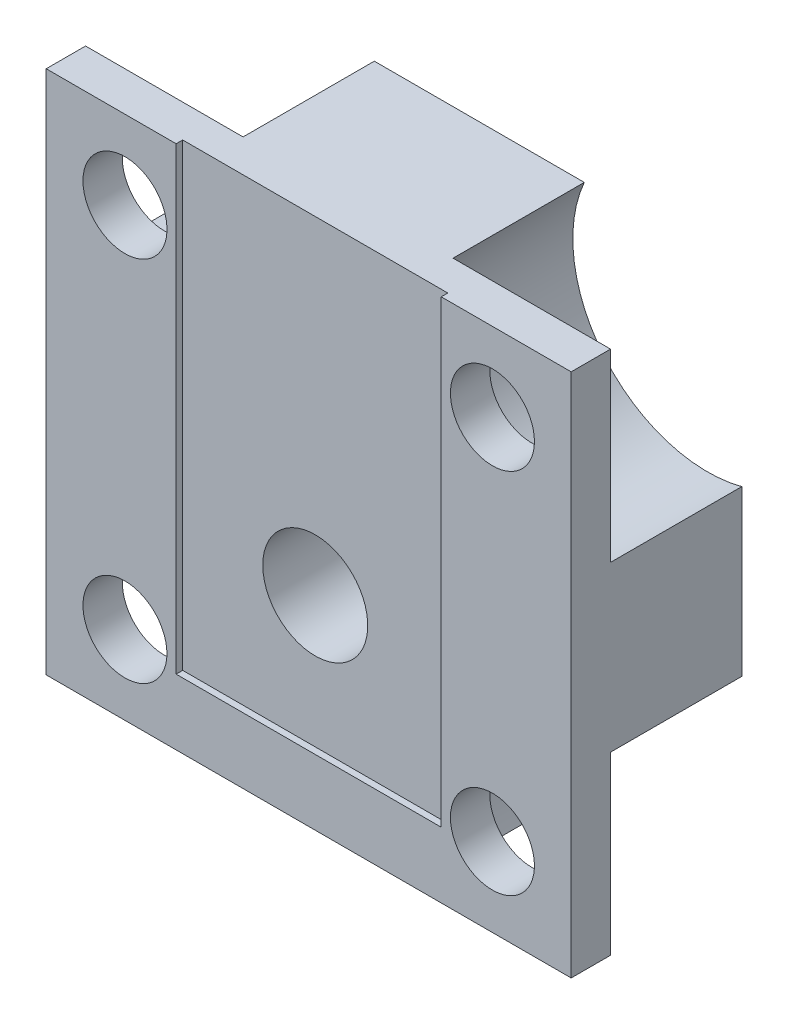
ISO-10303-21;
HEADER;
FILE_DESCRIPTION(('STEP AP214'),'2;1');
FILE_NAME('part.step','',(''),(''),'','','');
FILE_SCHEMA(('AUTOMOTIVE_DESIGN { 1 0 10303 214 1 1 1 1 }'));
ENDSEC;
DATA;
#1=APPLICATION_CONTEXT('core data for automotive mechanical design processes');
#2=APPLICATION_PROTOCOL_DEFINITION('international standard','automotive_design',2000,#1);
#3=PRODUCT_CONTEXT('',#1,'mechanical');
#4=PRODUCT('Part','Part','',(#3));
#5=PRODUCT_RELATED_PRODUCT_CATEGORY('part','',(#4));
#6=PRODUCT_DEFINITION_FORMATION('','',#4);
#7=PRODUCT_DEFINITION_CONTEXT('part definition',#1,'design');
#8=PRODUCT_DEFINITION('design','',#6,#7);
#9=PRODUCT_DEFINITION_SHAPE('','',#8);
#10=(LENGTH_UNIT() NAMED_UNIT(*) SI_UNIT(.MILLI.,.METRE.));
#11=(NAMED_UNIT(*) PLANE_ANGLE_UNIT() SI_UNIT($,.RADIAN.));
#12=(NAMED_UNIT(*) SI_UNIT($,.STERADIAN.) SOLID_ANGLE_UNIT());
#13=UNCERTAINTY_MEASURE_WITH_UNIT(LENGTH_MEASURE(1.E-05),#10,'distance_accuracy_value','');
#14=(GEOMETRIC_REPRESENTATION_CONTEXT(3) GLOBAL_UNCERTAINTY_ASSIGNED_CONTEXT((#13)) GLOBAL_UNIT_ASSIGNED_CONTEXT((#10,
#11,#12)) REPRESENTATION_CONTEXT('',''));
#15=CARTESIAN_POINT('',(0.,0.,0.));
#16=DIRECTION('',(0.,0.,1.));
#17=DIRECTION('',(1.,0.,0.));
#18=AXIS2_PLACEMENT_3D('',#15,#16,#17);
#19=CARTESIAN_POINT('',(0.,-2.5,-8.));
#20=DIRECTION('',(0.,0.,1.));
#21=DIRECTION('',(1.,0.,0.));
#22=AXIS2_PLACEMENT_3D('',#19,#20,#21);
#23=CYLINDRICAL_SURFACE('',#22,1.35);
#24=CARTESIAN_POINT('',(0.,-2.5,-7.));
#25=DIRECTION('',(0.,0.,-1.));
#26=DIRECTION('',(-1.,0.,0.));
#27=AXIS2_PLACEMENT_3D('',#24,#25,#26);
#28=CIRCLE('',#27,1.35);
#29=CARTESIAN_POINT('',(-1.35,-2.5,-7.));
#30=VERTEX_POINT('',#29);
#31=EDGE_CURVE('E11',#30,#30,#28,.F.);
#32=ORIENTED_EDGE('',*,*,#31,.T.);
#33=EDGE_LOOP('',(#32));
#34=FACE_BOUND('',#33,.T.);
#35=CARTESIAN_POINT('',(0.,-2.5,-6.5));
#36=DIRECTION('',(0.,0.,-1.));
#37=DIRECTION('',(-1.,0.,0.));
#38=AXIS2_PLACEMENT_3D('',#35,#36,#37);
#39=CIRCLE('',#38,1.35);
#40=CARTESIAN_POINT('',(-1.35,-2.5,-6.5));
#41=VERTEX_POINT('',#40);
#42=EDGE_CURVE('E57',#41,#41,#39,.T.);
#43=ORIENTED_EDGE('',*,*,#42,.T.);
#44=EDGE_LOOP('',(#43));
#45=FACE_BOUND('',#44,.T.);
#46=ADVANCED_FACE('F46',(#34,#45),#23,.T.);
#47=CARTESIAN_POINT('',(0.,-2.5,-8.));
#48=DIRECTION('',(0.,0.,-1.));
#49=DIRECTION('',(-1.,0.,0.));
#50=AXIS2_PLACEMENT_3D('',#47,#48,#49);
#51=PLANE('',#50);
#52=CARTESIAN_POINT('',(0.,-2.5,-8.));
#53=DIRECTION('',(0.,0.,-1.));
#54=DIRECTION('',(-1.,0.,0.));
#55=AXIS2_PLACEMENT_3D('',#52,#53,#54);
#56=CIRCLE('',#55,0.35);
#57=CARTESIAN_POINT('',(-0.35,-2.5,-8.));
#58=VERTEX_POINT('',#57);
#59=EDGE_CURVE('E53',#58,#58,#56,.T.);
#60=ORIENTED_EDGE('',*,*,#59,.T.);
#61=EDGE_LOOP('',(#60));
#62=FACE_BOUND('',#61,.T.);
#63=ADVANCED_FACE('F67',(#62),#51,.T.);
#64=CARTESIAN_POINT('',(0.,-2.5,-6.5));
#65=DIRECTION('',(0.,0.,-1.));
#66=DIRECTION('',(-1.,0.,0.));
#67=AXIS2_PLACEMENT_3D('',#64,#65,#66);
#68=PLANE('',#67);
#69=ORIENTED_EDGE('',*,*,#42,.F.);
#70=EDGE_LOOP('',(#69));
#71=FACE_BOUND('',#70,.T.);
#72=ADVANCED_FACE('F65',(#71),#68,.F.);
#73=CARTESIAN_POINT('',(0.,-2.5,-7.));
#74=DIRECTION('',(0.,0.,-1.));
#75=DIRECTION('',(-1.,0.,0.));
#76=AXIS2_PLACEMENT_3D('',#73,#74,#75);
#77=DEGENERATE_TOROIDAL_SURFACE('',#76,0.35,1.,.T.);
#78=ORIENTED_EDGE('',*,*,#31,.F.);
#79=EDGE_LOOP('',(#78));
#80=FACE_BOUND('',#79,.T.);
#81=ORIENTED_EDGE('',*,*,#59,.F.);
#82=EDGE_LOOP('',(#81));
#83=FACE_BOUND('',#82,.T.);
#84=ADVANCED_FACE('F48',(#80,#83),#77,.T.);
#85=CLOSED_SHELL('',(#46,#63,#72,#84));
#86=MANIFOLD_SOLID_BREP('B2',#85);
#87=CARTESIAN_POINT('',(10.,-10.,-1.5));
#88=DIRECTION('',(0.,0.,-1.));
#89=DIRECTION('',(-1.,0.,0.));
#90=AXIS2_PLACEMENT_3D('',#87,#88,#89);
#91=PLANE('',#90);
#92=CARTESIAN_POINT('',(7.,7.,-1.5));
#93=DIRECTION('',(0.,0.,1.));
#94=DIRECTION('',(1.,0.,0.));
#95=AXIS2_PLACEMENT_3D('',#92,#93,#94);
#96=CIRCLE('',#95,1.6);
#97=CARTESIAN_POINT('',(8.6,7.,-1.5));
#98=VERTEX_POINT('',#97);
#99=EDGE_CURVE('E318',#98,#98,#96,.T.);
#100=ORIENTED_EDGE('',*,*,#99,.T.);
#101=EDGE_LOOP('',(#100));
#102=FACE_BOUND('',#101,.T.);
#103=CARTESIAN_POINT('',(8.693225152791,7.925383175681,-1.5));
#104=DIRECTION('',(0.,0.,-1.));
#105=DIRECTION('',(-1.,0.,0.));
#106=AXIS2_PLACEMENT_3D('',#103,#104,#105);
#107=CIRCLE('',#106,5.131315357931);
#108=CARTESIAN_POINT('',(10.,2.96325290721379,-1.5));
#109=VERTEX_POINT('',#108);
#110=CARTESIAN_POINT('',(3.99999999999995,10.,-1.5));
#111=VERTEX_POINT('',#110);
#112=EDGE_CURVE('E113',#109,#111,#107,.T.);
#113=ORIENTED_EDGE('',*,*,#112,.T.);
#114=DIRECTION('',(-1.,0.,0.));
#115=VECTOR('',#114,1.);
#116=CARTESIAN_POINT('',(10.,10.,-1.5));
#117=LINE('',#116,#115);
#118=CARTESIAN_POINT('',(10.,10.,-1.5));
#119=VERTEX_POINT('',#118);
#120=EDGE_CURVE('E322',#111,#119,#117,.F.);
#121=ORIENTED_EDGE('',*,*,#120,.T.);
#122=DIRECTION('',(0.,1.,0.));
#123=VECTOR('',#122,1.);
#124=CARTESIAN_POINT('',(10.,-10.,-1.5));
#125=LINE('',#124,#123);
#126=EDGE_CURVE('E301',#119,#109,#125,.F.);
#127=ORIENTED_EDGE('',*,*,#126,.T.);
#128=EDGE_LOOP('',(#113,#121,#127));
#129=FACE_BOUND('',#128,.T.);
#130=ADVANCED_FACE('F109',(#102,#129),#91,.T.);
#131=CARTESIAN_POINT('',(7.,-7.,-1.5));
#132=DIRECTION('',(0.,0.,-1.));
#133=DIRECTION('',(-1.,0.,0.));
#134=AXIS2_PLACEMENT_3D('',#131,#132,#133);
#135=CIRCLE('',#134,1.6);
#136=CARTESIAN_POINT('',(5.4,-7.,-1.5));
#137=VERTEX_POINT('',#136);
#138=EDGE_CURVE('E315',#137,#137,#135,.F.);
#139=ORIENTED_EDGE('',*,*,#138,.T.);
#140=EDGE_LOOP('',(#139));
#141=FACE_BOUND('',#140,.T.);
#142=CARTESIAN_POINT('',(8.787094536655,-8.25,-1.5));
#143=DIRECTION('',(0.,0.,-1.));
#144=DIRECTION('',(-1.,0.,0.));
#145=AXIS2_PLACEMENT_3D('',#142,#143,#144);
#146=CIRCLE('',#145,5.096937718167);
#147=CARTESIAN_POINT('',(3.99999999999993,-10.,-1.5));
#148=VERTEX_POINT('',#147);
#149=CARTESIAN_POINT('',(10.,-3.29948139687757,-1.5));
#150=VERTEX_POINT('',#149);
#151=EDGE_CURVE('E163',#148,#150,#146,.T.);
#152=ORIENTED_EDGE('',*,*,#151,.T.);
#153=CARTESIAN_POINT('',(10.,-10.,-1.5));
#154=VERTEX_POINT('',#153);
#155=EDGE_CURVE('E296',#150,#154,#125,.F.);
#156=ORIENTED_EDGE('',*,*,#155,.T.);
#157=DIRECTION('',(-1.,0.,0.));
#158=VECTOR('',#157,1.);
#159=CARTESIAN_POINT('',(10.,-10.,-1.5));
#160=LINE('',#159,#158);
#161=EDGE_CURVE('E300',#154,#148,#160,.T.);
#162=ORIENTED_EDGE('',*,*,#161,.T.);
#163=EDGE_LOOP('',(#152,#156,#162));
#164=FACE_BOUND('',#163,.T.);
#165=ADVANCED_FACE('F298',(#141,#164),#91,.T.);
#166=CARTESIAN_POINT('',(-7.,-7.,-1.5));
#167=DIRECTION('',(0.,0.,1.));
#168=DIRECTION('',(1.,0.,0.));
#169=AXIS2_PLACEMENT_3D('',#166,#167,#168);
#170=CIRCLE('',#169,1.6);
#171=CARTESIAN_POINT('',(-5.4,-7.,-1.5));
#172=VERTEX_POINT('',#171);
#173=EDGE_CURVE('E377',#172,#172,#170,.T.);
#174=ORIENTED_EDGE('',*,*,#173,.T.);
#175=EDGE_LOOP('',(#174));
#176=FACE_BOUND('',#175,.T.);
#177=CARTESIAN_POINT('',(-8.787094536655,-8.25,-1.5));
#178=DIRECTION('',(0.,0.,-1.));
#179=DIRECTION('',(-1.,0.,0.));
#180=AXIS2_PLACEMENT_3D('',#177,#178,#179);
#181=CIRCLE('',#180,5.096937718167);
#182=CARTESIAN_POINT('',(-10.,-3.29948139687728,-1.5));
#183=VERTEX_POINT('',#182);
#184=CARTESIAN_POINT('',(-3.99999999999987,-10.,-1.5));
#185=VERTEX_POINT('',#184);
#186=EDGE_CURVE('E189',#183,#185,#181,.T.);
#187=ORIENTED_EDGE('',*,*,#186,.T.);
#188=CARTESIAN_POINT('',(-10.,-10.,-1.5));
#189=VERTEX_POINT('',#188);
#190=EDGE_CURVE('E225',#185,#189,#160,.T.);
#191=ORIENTED_EDGE('',*,*,#190,.T.);
#192=DIRECTION('',(0.,1.,0.));
#193=VECTOR('',#192,1.);
#194=CARTESIAN_POINT('',(-10.,-10.,-1.5));
#195=LINE('',#194,#193);
#196=EDGE_CURVE('E323',#189,#183,#195,.T.);
#197=ORIENTED_EDGE('',*,*,#196,.T.);
#198=EDGE_LOOP('',(#187,#191,#197));
#199=FACE_BOUND('',#198,.T.);
#200=ADVANCED_FACE('F440',(#176,#199),#91,.T.);
#201=CARTESIAN_POINT('',(-7.,7.,-1.5));
#202=DIRECTION('',(0.,0.,-1.));
#203=DIRECTION('',(-1.,0.,0.));
#204=AXIS2_PLACEMENT_3D('',#201,#202,#203);
#205=CIRCLE('',#204,1.6);
#206=CARTESIAN_POINT('',(-8.6,7.,-1.5));
#207=VERTEX_POINT('',#206);
#208=EDGE_CURVE('E374',#207,#207,#205,.F.);
#209=ORIENTED_EDGE('',*,*,#208,.T.);
#210=EDGE_LOOP('',(#209));
#211=FACE_BOUND('',#210,.T.);
#212=CARTESIAN_POINT('',(-8.693225152791,7.925383175681,-1.5));
#213=DIRECTION('',(0.,0.,-1.));
#214=DIRECTION('',(-1.,0.,0.));
#215=AXIS2_PLACEMENT_3D('',#212,#213,#214);
#216=CIRCLE('',#215,5.131315357931);
#217=CARTESIAN_POINT('',(-3.99999999999995,10.,-1.5));
#218=VERTEX_POINT('',#217);
#219=CARTESIAN_POINT('',(-10.,2.96325290721359,-1.5));
#220=VERTEX_POINT('',#219);
#221=EDGE_CURVE('E184',#218,#220,#216,.T.);
#222=ORIENTED_EDGE('',*,*,#221,.T.);
#223=CARTESIAN_POINT('',(-10.,10.,-1.5));
#224=VERTEX_POINT('',#223);
#225=EDGE_CURVE('E325',#220,#224,#195,.T.);
#226=ORIENTED_EDGE('',*,*,#225,.T.);
#227=EDGE_CURVE('E302',#224,#218,#117,.F.);
#228=ORIENTED_EDGE('',*,*,#227,.T.);
#229=EDGE_LOOP('',(#222,#226,#228));
#230=FACE_BOUND('',#229,.T.);
#231=ADVANCED_FACE('F442',(#211,#230),#91,.T.);
#232=CARTESIAN_POINT('',(0.,-7.5,-5.5));
#233=DIRECTION('',(0.,0.,1.));
#234=DIRECTION('',(1.,0.,0.));
#235=AXIS2_PLACEMENT_3D('',#232,#233,#234);
#236=PLANE('',#235);
#237=CARTESIAN_POINT('',(0.,-2.5,-5.5));
#238=DIRECTION('',(0.,0.,-1.));
#239=DIRECTION('',(-1.,0.,0.));
#240=AXIS2_PLACEMENT_3D('',#237,#238,#239);
#241=CIRCLE('',#240,1.35);
#242=CARTESIAN_POINT('',(-1.35,-2.5,-5.5));
#243=VERTEX_POINT('',#242);
#244=EDGE_CURVE('E373',#243,#243,#241,.T.);
#245=ORIENTED_EDGE('',*,*,#244,.T.);
#246=EDGE_LOOP('',(#245));
#247=FACE_BOUND('',#246,.T.);
#248=CARTESIAN_POINT('',(0.,-2.5,-5.5));
#249=DIRECTION('',(0.,0.,-1.));
#250=DIRECTION('',(-1.,0.,0.));
#251=AXIS2_PLACEMENT_3D('',#248,#249,#250);
#252=CIRCLE('',#251,2.);
#253=CARTESIAN_POINT('',(-2.,-2.5,-5.5));
#254=VERTEX_POINT('',#253);
#255=EDGE_CURVE('E399',#254,#254,#252,.F.);
#256=ORIENTED_EDGE('',*,*,#255,.T.);
#257=EDGE_LOOP('',(#256));
#258=FACE_BOUND('',#257,.T.);
#259=ADVANCED_FACE('F403',(#247,#258),#236,.T.);
#260=CARTESIAN_POINT('',(0.,-2.5,-1.5));
#261=DIRECTION('',(0.,0.,-1.));
#262=DIRECTION('',(-1.,0.,0.));
#263=AXIS2_PLACEMENT_3D('',#260,#261,#262);
#264=CYLINDRICAL_SURFACE('',#263,2.);
#265=ORIENTED_EDGE('',*,*,#255,.F.);
#266=EDGE_LOOP('',(#265));
#267=FACE_BOUND('',#266,.T.);
#268=CARTESIAN_POINT('',(0.,-2.5,-0.25));
#269=DIRECTION('',(0.,0.,-1.));
#270=DIRECTION('',(-1.,0.,0.));
#271=AXIS2_PLACEMENT_3D('',#268,#269,#270);
#272=CIRCLE('',#271,2.);
#273=CARTESIAN_POINT('',(-2.,-2.5,-0.25));
#274=VERTEX_POINT('',#273);
#275=EDGE_CURVE('E359',#274,#274,#272,.F.);
#276=ORIENTED_EDGE('',*,*,#275,.T.);
#277=EDGE_LOOP('',(#276));
#278=FACE_BOUND('',#277,.T.);
#279=ADVANCED_FACE('F405',(#267,#278),#264,.F.);
#280=CARTESIAN_POINT('',(0.,-2.5,-6.5));
#281=DIRECTION('',(0.,0.,-1.));
#282=DIRECTION('',(-1.,0.,0.));
#283=AXIS2_PLACEMENT_3D('',#280,#281,#282);
#284=CYLINDRICAL_SURFACE('',#283,1.35);
#285=CARTESIAN_POINT('',(0.,-2.5,-6.5));
#286=DIRECTION('',(0.,0.,-1.));
#287=DIRECTION('',(-1.,0.,0.));
#288=AXIS2_PLACEMENT_3D('',#285,#286,#287);
#289=CIRCLE('',#288,1.35);
#290=CARTESIAN_POINT('',(-1.35,-2.5,-6.5));
#291=VERTEX_POINT('',#290);
#292=EDGE_CURVE('E355',#291,#291,#289,.F.);
#293=ORIENTED_EDGE('',*,*,#292,.F.);
#294=EDGE_LOOP('',(#293));
#295=FACE_BOUND('',#294,.T.);
#296=ORIENTED_EDGE('',*,*,#244,.F.);
#297=EDGE_LOOP('',(#296));
#298=FACE_BOUND('',#297,.T.);
#299=ADVANCED_FACE('F408',(#295,#298),#284,.F.);
#300=CARTESIAN_POINT('',(5.05,10.,0.25));
#301=DIRECTION('',(1.,0.,0.));
#302=DIRECTION('',(0.,0.,-1.));
#303=AXIS2_PLACEMENT_3D('',#300,#301,#302);
#304=PLANE('',#303);
#305=DIRECTION('',(0.,1.,0.));
#306=VECTOR('',#305,1.);
#307=CARTESIAN_POINT('',(5.05,10.,-0.25));
#308=LINE('',#307,#306);
#309=CARTESIAN_POINT('',(5.05,10.,-0.25));
#310=VERTEX_POINT('',#309);
#311=CARTESIAN_POINT('',(5.05,-7.5,-0.25));
#312=VERTEX_POINT('',#311);
#313=EDGE_CURVE('E362',#310,#312,#308,.F.);
#314=ORIENTED_EDGE('',*,*,#313,.T.);
#315=DIRECTION('',(0.,0.,1.));
#316=VECTOR('',#315,1.);
#317=CARTESIAN_POINT('',(5.05,-7.5,0.));
#318=LINE('',#317,#316);
#319=CARTESIAN_POINT('',(5.05,-7.5,0.));
#320=VERTEX_POINT('',#319);
#321=EDGE_CURVE('E368',#320,#312,#318,.F.);
#322=ORIENTED_EDGE('',*,*,#321,.F.);
#323=DIRECTION('',(0.,1.,0.));
#324=VECTOR('',#323,1.);
#325=CARTESIAN_POINT('',(5.05,0.,0.));
#326=LINE('',#325,#324);
#327=CARTESIAN_POINT('',(5.05,10.,0.));
#328=VERTEX_POINT('',#327);
#329=EDGE_CURVE('E352',#328,#320,#326,.F.);
#330=ORIENTED_EDGE('',*,*,#329,.F.);
#331=DIRECTION('',(0.,0.,-1.));
#332=VECTOR('',#331,1.);
#333=CARTESIAN_POINT('',(5.05,10.,0.25));
#334=LINE('',#333,#332);
#335=EDGE_CURVE('E371',#310,#328,#334,.F.);
#336=ORIENTED_EDGE('',*,*,#335,.F.);
#337=EDGE_LOOP('',(#314,#322,#330,#336));
#338=FACE_BOUND('',#337,.T.);
#339=ADVANCED_FACE('F433',(#338),#304,.F.);
#340=CARTESIAN_POINT('',(0.,-7.5,0.));
#341=DIRECTION('',(0.,1.,0.));
#342=DIRECTION('',(0.,0.,1.));
#343=AXIS2_PLACEMENT_3D('',#340,#341,#342);
#344=PLANE('',#343);
#345=DIRECTION('',(0.,0.,1.));
#346=VECTOR('',#345,1.);
#347=CARTESIAN_POINT('',(-5.05,-7.5,-0.25));
#348=LINE('',#347,#346);
#349=CARTESIAN_POINT('',(-5.05,-7.5,-0.25));
#350=VERTEX_POINT('',#349);
#351=CARTESIAN_POINT('',(-5.05,-7.5,0.));
#352=VERTEX_POINT('',#351);
#353=EDGE_CURVE('E364',#350,#352,#348,.T.);
#354=ORIENTED_EDGE('',*,*,#353,.T.);
#355=DIRECTION('',(1.,0.,0.));
#356=VECTOR('',#355,1.);
#357=CARTESIAN_POINT('',(0.,-7.5,0.));
#358=LINE('',#357,#356);
#359=EDGE_CURVE('E349',#320,#352,#358,.F.);
#360=ORIENTED_EDGE('',*,*,#359,.F.);
#361=ORIENTED_EDGE('',*,*,#321,.T.);
#362=DIRECTION('',(-1.,0.,0.));
#363=VECTOR('',#362,1.);
#364=CARTESIAN_POINT('',(5.05,-7.5,-0.25));
#365=LINE('',#364,#363);
#366=EDGE_CURVE('E360',#312,#350,#365,.T.);
#367=ORIENTED_EDGE('',*,*,#366,.T.);
#368=EDGE_LOOP('',(#354,#360,#361,#367));
#369=FACE_BOUND('',#368,.T.);
#370=ADVANCED_FACE('F424',(#369),#344,.T.);
#371=CARTESIAN_POINT('',(-5.05,10.,-0.25));
#372=DIRECTION('',(-1.,0.,0.));
#373=DIRECTION('',(0.,0.,1.));
#374=AXIS2_PLACEMENT_3D('',#371,#372,#373);
#375=PLANE('',#374);
#376=DIRECTION('',(0.,1.,0.));
#377=VECTOR('',#376,1.);
#378=CARTESIAN_POINT('',(-5.05,10.,-0.25));
#379=LINE('',#378,#377);
#380=CARTESIAN_POINT('',(-5.05,10.,-0.25));
#381=VERTEX_POINT('',#380);
#382=EDGE_CURVE('E356',#350,#381,#379,.T.);
#383=ORIENTED_EDGE('',*,*,#382,.T.);
#384=DIRECTION('',(0.,0.,1.));
#385=VECTOR('',#384,1.);
#386=CARTESIAN_POINT('',(-5.05,10.,-0.25));
#387=LINE('',#386,#385);
#388=CARTESIAN_POINT('',(-5.05,10.,0.));
#389=VERTEX_POINT('',#388);
#390=EDGE_CURVE('E366',#389,#381,#387,.F.);
#391=ORIENTED_EDGE('',*,*,#390,.F.);
#392=DIRECTION('',(0.,1.,0.));
#393=VECTOR('',#392,1.);
#394=CARTESIAN_POINT('',(-5.05,0.,0.));
#395=LINE('',#394,#393);
#396=EDGE_CURVE('E346',#352,#389,#395,.T.);
#397=ORIENTED_EDGE('',*,*,#396,.F.);
#398=ORIENTED_EDGE('',*,*,#353,.F.);
#399=EDGE_LOOP('',(#383,#391,#397,#398));
#400=FACE_BOUND('',#399,.T.);
#401=ADVANCED_FACE('F416',(#400),#375,.F.);
#402=CARTESIAN_POINT('',(5.05,10.,-0.25));
#403=DIRECTION('',(0.,0.,-1.));
#404=DIRECTION('',(-1.,0.,0.));
#405=AXIS2_PLACEMENT_3D('',#402,#403,#404);
#406=PLANE('',#405);
#407=ORIENTED_EDGE('',*,*,#275,.F.);
#408=EDGE_LOOP('',(#407));
#409=FACE_BOUND('',#408,.T.);
#410=ORIENTED_EDGE('',*,*,#366,.F.);
#411=ORIENTED_EDGE('',*,*,#313,.F.);
#412=DIRECTION('',(1.,0.,0.));
#413=VECTOR('',#412,1.);
#414=CARTESIAN_POINT('',(0.,10.,-0.25));
#415=LINE('',#414,#413);
#416=EDGE_CURVE('E341',#381,#310,#415,.T.);
#417=ORIENTED_EDGE('',*,*,#416,.F.);
#418=ORIENTED_EDGE('',*,*,#382,.F.);
#419=EDGE_LOOP('',(#410,#411,#417,#418));
#420=FACE_BOUND('',#419,.T.);
#421=ADVANCED_FACE('F412',(#409,#420),#406,.F.);
#422=CARTESIAN_POINT('',(0.,0.,0.));
#423=DIRECTION('',(0.,0.,1.));
#424=DIRECTION('',(1.,0.,0.));
#425=AXIS2_PLACEMENT_3D('',#422,#423,#424);
#426=PLANE('',#425);
#427=CARTESIAN_POINT('',(-7.,7.,0.));
#428=DIRECTION('',(0.,0.,-1.));
#429=DIRECTION('',(-1.,0.,0.));
#430=AXIS2_PLACEMENT_3D('',#427,#428,#429);
#431=CIRCLE('',#430,1.6);
#432=CARTESIAN_POINT('',(-8.6,7.,0.));
#433=VERTEX_POINT('',#432);
#434=EDGE_CURVE('E382',#433,#433,#431,.T.);
#435=ORIENTED_EDGE('',*,*,#434,.T.);
#436=EDGE_LOOP('',(#435));
#437=FACE_BOUND('',#436,.T.);
#438=CARTESIAN_POINT('',(-7.,-7.,0.));
#439=DIRECTION('',(0.,0.,1.));
#440=DIRECTION('',(1.,0.,0.));
#441=AXIS2_PLACEMENT_3D('',#438,#439,#440);
#442=CIRCLE('',#441,1.6);
#443=CARTESIAN_POINT('',(-5.4,-7.,0.));
#444=VERTEX_POINT('',#443);
#445=EDGE_CURVE('E385',#444,#444,#442,.F.);
#446=ORIENTED_EDGE('',*,*,#445,.T.);
#447=EDGE_LOOP('',(#446));
#448=FACE_BOUND('',#447,.T.);
#449=CARTESIAN_POINT('',(7.,7.,0.));
#450=DIRECTION('',(0.,0.,1.));
#451=DIRECTION('',(1.,0.,0.));
#452=AXIS2_PLACEMENT_3D('',#449,#450,#451);
#453=CIRCLE('',#452,1.6);
#454=CARTESIAN_POINT('',(8.6,7.,0.));
#455=VERTEX_POINT('',#454);
#456=EDGE_CURVE('E388',#455,#455,#453,.F.);
#457=ORIENTED_EDGE('',*,*,#456,.T.);
#458=EDGE_LOOP('',(#457));
#459=FACE_BOUND('',#458,.T.);
#460=CARTESIAN_POINT('',(7.,-7.,0.));
#461=DIRECTION('',(0.,0.,-1.));
#462=DIRECTION('',(-1.,0.,0.));
#463=AXIS2_PLACEMENT_3D('',#460,#461,#462);
#464=CIRCLE('',#463,1.6);
#465=CARTESIAN_POINT('',(5.4,-7.,0.));
#466=VERTEX_POINT('',#465);
#467=EDGE_CURVE('E327',#466,#466,#464,.T.);
#468=ORIENTED_EDGE('',*,*,#467,.T.);
#469=EDGE_LOOP('',(#468));
#470=FACE_BOUND('',#469,.T.);
#471=DIRECTION('',(0.,1.,0.));
#472=VECTOR('',#471,1.);
#473=CARTESIAN_POINT('',(-10.,-10.,0.));
#474=LINE('',#473,#472);
#475=CARTESIAN_POINT('',(-10.,-10.,0.));
#476=VERTEX_POINT('',#475);
#477=CARTESIAN_POINT('',(-10.,10.,0.));
#478=VERTEX_POINT('',#477);
#479=EDGE_CURVE('E344',#476,#478,#474,.T.);
#480=ORIENTED_EDGE('',*,*,#479,.F.);
#481=DIRECTION('',(1.,0.,0.));
#482=VECTOR('',#481,1.);
#483=CARTESIAN_POINT('',(0.,-10.,0.));
#484=LINE('',#483,#482);
#485=CARTESIAN_POINT('',(10.,-10.,0.));
#486=VERTEX_POINT('',#485);
#487=EDGE_CURVE('E312',#476,#486,#484,.T.);
#488=ORIENTED_EDGE('',*,*,#487,.T.);
#489=DIRECTION('',(0.,1.,0.));
#490=VECTOR('',#489,1.);
#491=CARTESIAN_POINT('',(10.,-10.,0.));
#492=LINE('',#491,#490);
#493=CARTESIAN_POINT('',(10.,10.,0.));
#494=VERTEX_POINT('',#493);
#495=EDGE_CURVE('E309',#494,#486,#492,.F.);
#496=ORIENTED_EDGE('',*,*,#495,.F.);
#497=DIRECTION('',(1.,0.,0.));
#498=VECTOR('',#497,1.);
#499=CARTESIAN_POINT('',(0.,10.,0.));
#500=LINE('',#499,#498);
#501=EDGE_CURVE('E339',#328,#494,#500,.T.);
#502=ORIENTED_EDGE('',*,*,#501,.F.);
#503=ORIENTED_EDGE('',*,*,#329,.T.);
#504=ORIENTED_EDGE('',*,*,#359,.T.);
#505=ORIENTED_EDGE('',*,*,#396,.T.);
#506=DIRECTION('',(1.,0.,0.));
#507=VECTOR('',#506,1.);
#508=CARTESIAN_POINT('',(0.,10.,0.));
#509=LINE('',#508,#507);
#510=EDGE_CURVE('E333',#478,#389,#509,.T.);
#511=ORIENTED_EDGE('',*,*,#510,.F.);
#512=EDGE_LOOP('',(#480,#488,#496,#502,#503,#504,#505,#511));
#513=FACE_BOUND('',#512,.T.);
#514=ADVANCED_FACE('F415',(#437,#448,#459,#470,#513),#426,.T.);
#515=CARTESIAN_POINT('',(7.,-7.,1.5));
#516=DIRECTION('',(0.,0.,-1.));
#517=DIRECTION('',(-1.,0.,0.));
#518=AXIS2_PLACEMENT_3D('',#515,#516,#517);
#519=CYLINDRICAL_SURFACE('',#518,1.6);
#520=ORIENTED_EDGE('',*,*,#138,.F.);
#521=EDGE_LOOP('',(#520));
#522=FACE_BOUND('',#521,.T.);
#523=ORIENTED_EDGE('',*,*,#467,.F.);
#524=EDGE_LOOP('',(#523));
#525=FACE_BOUND('',#524,.T.);
#526=ADVANCED_FACE('F465',(#522,#525),#519,.F.);
#527=CARTESIAN_POINT('',(7.,7.,1.5));
#528=DIRECTION('',(0.,0.,1.));
#529=DIRECTION('',(1.,0.,0.));
#530=AXIS2_PLACEMENT_3D('',#527,#528,#529);
#531=CYLINDRICAL_SURFACE('',#530,1.6);
#532=ORIENTED_EDGE('',*,*,#99,.F.);
#533=EDGE_LOOP('',(#532));
#534=FACE_BOUND('',#533,.T.);
#535=ORIENTED_EDGE('',*,*,#456,.F.);
#536=EDGE_LOOP('',(#535));
#537=FACE_BOUND('',#536,.T.);
#538=ADVANCED_FACE('F461',(#534,#537),#531,.F.);
#539=CARTESIAN_POINT('',(-7.,-7.,1.5));
#540=DIRECTION('',(0.,0.,1.));
#541=DIRECTION('',(1.,0.,0.));
#542=AXIS2_PLACEMENT_3D('',#539,#540,#541);
#543=CYLINDRICAL_SURFACE('',#542,1.6);
#544=ORIENTED_EDGE('',*,*,#173,.F.);
#545=EDGE_LOOP('',(#544));
#546=FACE_BOUND('',#545,.T.);
#547=ORIENTED_EDGE('',*,*,#445,.F.);
#548=EDGE_LOOP('',(#547));
#549=FACE_BOUND('',#548,.T.);
#550=ADVANCED_FACE('F464',(#546,#549),#543,.F.);
#551=CARTESIAN_POINT('',(-7.,7.,1.5));
#552=DIRECTION('',(0.,0.,-1.));
#553=DIRECTION('',(-1.,0.,0.));
#554=AXIS2_PLACEMENT_3D('',#551,#552,#553);
#555=CYLINDRICAL_SURFACE('',#554,1.6);
#556=ORIENTED_EDGE('',*,*,#208,.F.);
#557=EDGE_LOOP('',(#556));
#558=FACE_BOUND('',#557,.T.);
#559=ORIENTED_EDGE('',*,*,#434,.F.);
#560=EDGE_LOOP('',(#559));
#561=FACE_BOUND('',#560,.T.);
#562=ADVANCED_FACE('F450',(#558,#561),#555,.F.);
#563=CARTESIAN_POINT('',(8.693225152791,7.925383175681,-1.5));
#564=DIRECTION('',(0.,0.,-1.));
#565=DIRECTION('',(-1.,0.,0.));
#566=AXIS2_PLACEMENT_3D('',#563,#564,#565);
#567=CYLINDRICAL_SURFACE('',#566,5.131315357931);
#568=CARTESIAN_POINT('',(8.693225152791,7.925383175681,-6.5));
#569=DIRECTION('',(0.,0.,-1.));
#570=DIRECTION('',(-1.,0.,0.));
#571=AXIS2_PLACEMENT_3D('',#568,#569,#570);
#572=CIRCLE('',#571,5.131315357931);
#573=CARTESIAN_POINT('',(3.99999999999995,10.,-6.5));
#574=VERTEX_POINT('',#573);
#575=CARTESIAN_POINT('',(10.,2.9632529072138,-6.5));
#576=VERTEX_POINT('',#575);
#577=EDGE_CURVE('E157',#574,#576,#572,.F.);
#578=ORIENTED_EDGE('',*,*,#577,.F.);
#579=DIRECTION('',(0.,0.,1.));
#580=VECTOR('',#579,1.);
#581=CARTESIAN_POINT('',(4.,10.,-1.5));
#582=LINE('',#581,#580);
#583=EDGE_CURVE('E179',#111,#574,#582,.F.);
#584=ORIENTED_EDGE('',*,*,#583,.F.);
#585=ORIENTED_EDGE('',*,*,#112,.F.);
#586=DIRECTION('',(0.,0.,-1.));
#587=VECTOR('',#586,1.);
#588=CARTESIAN_POINT('',(10.,2.963252907214,-1.5));
#589=LINE('',#588,#587);
#590=EDGE_CURVE('E153',#576,#109,#589,.F.);
#591=ORIENTED_EDGE('',*,*,#590,.F.);
#592=EDGE_LOOP('',(#578,#584,#585,#591));
#593=FACE_BOUND('',#592,.T.);
#594=ADVANCED_FACE('F111',(#593),#567,.F.);
#595=CARTESIAN_POINT('',(10.,2.963252907214,-1.5));
#596=DIRECTION('',(1.,0.,0.));
#597=DIRECTION('',(0.,0.,-1.));
#598=AXIS2_PLACEMENT_3D('',#595,#596,#597);
#599=PLANE('',#598);
#600=ORIENTED_EDGE('',*,*,#590,.T.);
#601=ORIENTED_EDGE('',*,*,#126,.F.);
#602=DIRECTION('',(0.,0.,-1.));
#603=VECTOR('',#602,1.);
#604=CARTESIAN_POINT('',(10.,10.,1.5));
#605=LINE('',#604,#603);
#606=EDGE_CURVE('E331',#119,#494,#605,.F.);
#607=ORIENTED_EDGE('',*,*,#606,.T.);
#608=ORIENTED_EDGE('',*,*,#495,.T.);
#609=DIRECTION('',(0.,0.,1.));
#610=VECTOR('',#609,1.);
#611=CARTESIAN_POINT('',(10.,-10.,0.));
#612=LINE('',#611,#610);
#613=EDGE_CURVE('E306',#486,#154,#612,.F.);
#614=ORIENTED_EDGE('',*,*,#613,.T.);
#615=ORIENTED_EDGE('',*,*,#155,.F.);
#616=DIRECTION('',(0.,0.,-1.));
#617=VECTOR('',#616,1.);
#618=CARTESIAN_POINT('',(9.99999999999987,-3.29948139687754,-1.5));
#619=LINE('',#618,#617);
#620=CARTESIAN_POINT('',(9.99999999999993,-3.29948139687755,-6.5));
#621=VERTEX_POINT('',#620);
#622=EDGE_CURVE('E170',#150,#621,#619,.T.);
#623=ORIENTED_EDGE('',*,*,#622,.T.);
#624=DIRECTION('',(0.,1.,0.));
#625=VECTOR('',#624,1.);
#626=CARTESIAN_POINT('',(10.,-10.,-6.5));
#627=LINE('',#626,#625);
#628=EDGE_CURVE('E166',#576,#621,#627,.F.);
#629=ORIENTED_EDGE('',*,*,#628,.F.);
#630=EDGE_LOOP('',(#600,#601,#607,#608,#614,#615,#623,#629));
#631=FACE_BOUND('',#630,.T.);
#632=ADVANCED_FACE('F167',(#631),#599,.T.);
#633=CARTESIAN_POINT('',(8.787094536655,-8.25,-1.5));
#634=DIRECTION('',(0.,0.,-1.));
#635=DIRECTION('',(-1.,0.,0.));
#636=AXIS2_PLACEMENT_3D('',#633,#634,#635);
#637=CYLINDRICAL_SURFACE('',#636,5.096937718167);
#638=ORIENTED_EDGE('',*,*,#622,.F.);
#639=ORIENTED_EDGE('',*,*,#151,.F.);
#640=DIRECTION('',(0.,0.,-1.));
#641=VECTOR('',#640,1.);
#642=CARTESIAN_POINT('',(4.,-10.,-1.5));
#643=LINE('',#642,#641);
#644=CARTESIAN_POINT('',(3.99999999999993,-10.,-6.5));
#645=VERTEX_POINT('',#644);
#646=EDGE_CURVE('E192',#645,#148,#643,.F.);
#647=ORIENTED_EDGE('',*,*,#646,.F.);
#648=CARTESIAN_POINT('',(8.787094536655,-8.25,-6.5));
#649=DIRECTION('',(0.,0.,-1.));
#650=DIRECTION('',(-1.,0.,0.));
#651=AXIS2_PLACEMENT_3D('',#648,#649,#650);
#652=CIRCLE('',#651,5.096937718167);
#653=EDGE_CURVE('E173',#621,#645,#652,.F.);
#654=ORIENTED_EDGE('',*,*,#653,.F.);
#655=EDGE_LOOP('',(#638,#639,#647,#654));
#656=FACE_BOUND('',#655,.T.);
#657=ADVANCED_FACE('F507',(#656),#637,.F.);
#658=CARTESIAN_POINT('',(4.,-10.,-1.5));
#659=DIRECTION('',(0.,-1.,0.));
#660=DIRECTION('',(0.,0.,-1.));
#661=AXIS2_PLACEMENT_3D('',#658,#659,#660);
#662=PLANE('',#661);
#663=ORIENTED_EDGE('',*,*,#646,.T.);
#664=ORIENTED_EDGE('',*,*,#161,.F.);
#665=ORIENTED_EDGE('',*,*,#613,.F.);
#666=ORIENTED_EDGE('',*,*,#487,.F.);
#667=DIRECTION('',(0.,0.,1.));
#668=VECTOR('',#667,1.);
#669=CARTESIAN_POINT('',(-10.,-10.,0.));
#670=LINE('',#669,#668);
#671=EDGE_CURVE('E311',#189,#476,#670,.T.);
#672=ORIENTED_EDGE('',*,*,#671,.F.);
#673=ORIENTED_EDGE('',*,*,#190,.F.);
#674=DIRECTION('',(0.,0.,-1.));
#675=VECTOR('',#674,1.);
#676=CARTESIAN_POINT('',(-3.99999999999988,-10.,-1.5));
#677=LINE('',#676,#675);
#678=CARTESIAN_POINT('',(-3.99999999999987,-10.,-6.5));
#679=VERTEX_POINT('',#678);
#680=EDGE_CURVE('E191',#185,#679,#677,.T.);
#681=ORIENTED_EDGE('',*,*,#680,.T.);
#682=DIRECTION('',(-1.,0.,0.));
#683=VECTOR('',#682,1.);
#684=CARTESIAN_POINT('',(0.,-10.,-6.5));
#685=LINE('',#684,#683);
#686=EDGE_CURVE('E206',#645,#679,#685,.T.);
#687=ORIENTED_EDGE('',*,*,#686,.F.);
#688=EDGE_LOOP('',(#663,#664,#665,#666,#672,#673,#681,#687));
#689=FACE_BOUND('',#688,.T.);
#690=ADVANCED_FACE('F221',(#689),#662,.T.);
#691=CARTESIAN_POINT('',(-8.787094536655,-8.25,-1.5));
#692=DIRECTION('',(0.,0.,-1.));
#693=DIRECTION('',(-1.,0.,0.));
#694=AXIS2_PLACEMENT_3D('',#691,#692,#693);
#695=CYLINDRICAL_SURFACE('',#694,5.096937718167);
#696=ORIENTED_EDGE('',*,*,#680,.F.);
#697=ORIENTED_EDGE('',*,*,#186,.F.);
#698=DIRECTION('',(0.,0.,1.));
#699=VECTOR('',#698,1.);
#700=CARTESIAN_POINT('',(-10.,-3.299481396877,-1.5));
#701=LINE('',#700,#699);
#702=CARTESIAN_POINT('',(-10.,-3.29948139687728,-6.5));
#703=VERTEX_POINT('',#702);
#704=EDGE_CURVE('E188',#703,#183,#701,.T.);
#705=ORIENTED_EDGE('',*,*,#704,.F.);
#706=CARTESIAN_POINT('',(-8.787094536655,-8.25,-6.5));
#707=DIRECTION('',(0.,0.,-1.));
#708=DIRECTION('',(-1.,0.,0.));
#709=AXIS2_PLACEMENT_3D('',#706,#707,#708);
#710=CIRCLE('',#709,5.096937718167);
#711=EDGE_CURVE('E205',#679,#703,#710,.F.);
#712=ORIENTED_EDGE('',*,*,#711,.F.);
#713=EDGE_LOOP('',(#696,#697,#705,#712));
#714=FACE_BOUND('',#713,.T.);
#715=ADVANCED_FACE('F228',(#714),#695,.F.);
#716=CARTESIAN_POINT('',(-10.,-3.299481396877,-1.5));
#717=DIRECTION('',(-1.,0.,0.));
#718=DIRECTION('',(0.,0.,1.));
#719=AXIS2_PLACEMENT_3D('',#716,#717,#718);
#720=PLANE('',#719);
#721=ORIENTED_EDGE('',*,*,#704,.T.);
#722=ORIENTED_EDGE('',*,*,#196,.F.);
#723=ORIENTED_EDGE('',*,*,#671,.T.);
#724=ORIENTED_EDGE('',*,*,#479,.T.);
#725=DIRECTION('',(0.,0.,1.));
#726=VECTOR('',#725,1.);
#727=CARTESIAN_POINT('',(-10.,10.,0.));
#728=LINE('',#727,#726);
#729=EDGE_CURVE('E336',#224,#478,#728,.T.);
#730=ORIENTED_EDGE('',*,*,#729,.F.);
#731=ORIENTED_EDGE('',*,*,#225,.F.);
#732=DIRECTION('',(0.,0.,-1.));
#733=VECTOR('',#732,1.);
#734=CARTESIAN_POINT('',(-10.0000000000001,2.96325290721362,-1.5));
#735=LINE('',#734,#733);
#736=CARTESIAN_POINT('',(-10.,2.9632529072136,-6.5));
#737=VERTEX_POINT('',#736);
#738=EDGE_CURVE('E187',#220,#737,#735,.T.);
#739=ORIENTED_EDGE('',*,*,#738,.T.);
#740=DIRECTION('',(0.,1.,0.));
#741=VECTOR('',#740,1.);
#742=CARTESIAN_POINT('',(-10.,-10.,-6.5));
#743=LINE('',#742,#741);
#744=EDGE_CURVE('E204',#703,#737,#743,.T.);
#745=ORIENTED_EDGE('',*,*,#744,.F.);
#746=EDGE_LOOP('',(#721,#722,#723,#724,#730,#731,#739,#745));
#747=FACE_BOUND('',#746,.T.);
#748=ADVANCED_FACE('F233',(#747),#720,.T.);
#749=CARTESIAN_POINT('',(-8.693225152791,7.925383175681,-1.5));
#750=DIRECTION('',(0.,0.,-1.));
#751=DIRECTION('',(-1.,0.,0.));
#752=AXIS2_PLACEMENT_3D('',#749,#750,#751);
#753=CYLINDRICAL_SURFACE('',#752,5.131315357931);
#754=CARTESIAN_POINT('',(-8.693225152791,7.925383175681,-6.5));
#755=DIRECTION('',(0.,0.,-1.));
#756=DIRECTION('',(-1.,0.,0.));
#757=AXIS2_PLACEMENT_3D('',#754,#755,#756);
#758=CIRCLE('',#757,5.131315357931);
#759=CARTESIAN_POINT('',(-3.99999999999995,10.,-6.5));
#760=VERTEX_POINT('',#759);
#761=EDGE_CURVE('E119',#737,#760,#758,.F.);
#762=ORIENTED_EDGE('',*,*,#761,.F.);
#763=ORIENTED_EDGE('',*,*,#738,.F.);
#764=ORIENTED_EDGE('',*,*,#221,.F.);
#765=DIRECTION('',(0.,0.,1.));
#766=VECTOR('',#765,1.);
#767=CARTESIAN_POINT('',(-4.,10.,-1.5));
#768=LINE('',#767,#766);
#769=EDGE_CURVE('E128',#760,#218,#768,.T.);
#770=ORIENTED_EDGE('',*,*,#769,.F.);
#771=EDGE_LOOP('',(#762,#763,#764,#770));
#772=FACE_BOUND('',#771,.T.);
#773=ADVANCED_FACE('F236',(#772),#753,.F.);
#774=CARTESIAN_POINT('',(-4.,10.,-1.5));
#775=DIRECTION('',(0.,1.,0.));
#776=DIRECTION('',(0.,0.,1.));
#777=AXIS2_PLACEMENT_3D('',#774,#775,#776);
#778=PLANE('',#777);
#779=ORIENTED_EDGE('',*,*,#769,.T.);
#780=ORIENTED_EDGE('',*,*,#227,.F.);
#781=ORIENTED_EDGE('',*,*,#729,.T.);
#782=ORIENTED_EDGE('',*,*,#510,.T.);
#783=ORIENTED_EDGE('',*,*,#390,.T.);
#784=ORIENTED_EDGE('',*,*,#416,.T.);
#785=ORIENTED_EDGE('',*,*,#335,.T.);
#786=ORIENTED_EDGE('',*,*,#501,.T.);
#787=ORIENTED_EDGE('',*,*,#606,.F.);
#788=ORIENTED_EDGE('',*,*,#120,.F.);
#789=ORIENTED_EDGE('',*,*,#583,.T.);
#790=DIRECTION('',(-1.,0.,0.));
#791=VECTOR('',#790,1.);
#792=CARTESIAN_POINT('',(0.,10.,-6.5));
#793=LINE('',#792,#791);
#794=EDGE_CURVE('E44',#760,#574,#793,.F.);
#795=ORIENTED_EDGE('',*,*,#794,.F.);
#796=EDGE_LOOP('',(#779,#780,#781,#782,#783,#784,#785,#786,#787,#788,#789,#795));
#797=FACE_BOUND('',#796,.T.);
#798=ADVANCED_FACE('F435',(#797),#778,.T.);
#799=CARTESIAN_POINT('',(0.,-10.,-6.5));
#800=DIRECTION('',(0.,0.,-1.));
#801=DIRECTION('',(-1.,0.,0.));
#802=AXIS2_PLACEMENT_3D('',#799,#800,#801);
#803=PLANE('',#802);
#804=ORIENTED_EDGE('',*,*,#711,.T.);
#805=ORIENTED_EDGE('',*,*,#744,.T.);
#806=ORIENTED_EDGE('',*,*,#761,.T.);
#807=ORIENTED_EDGE('',*,*,#794,.T.);
#808=ORIENTED_EDGE('',*,*,#577,.T.);
#809=ORIENTED_EDGE('',*,*,#628,.T.);
#810=ORIENTED_EDGE('',*,*,#653,.T.);
#811=ORIENTED_EDGE('',*,*,#686,.T.);
#812=EDGE_LOOP('',(#804,#805,#806,#807,#808,#809,#810,#811));
#813=FACE_BOUND('',#812,.T.);
#814=ORIENTED_EDGE('',*,*,#292,.T.);
#815=EDGE_LOOP('',(#814));
#816=FACE_BOUND('',#815,.T.);
#817=ADVANCED_FACE('F175',(#813,#816),#803,.T.);
#818=CLOSED_SHELL('',(#130,#165,#200,#231,#259,#279,#299,#339,#370,#401,#421,#514,#526,#538,
#550,#562,#594,#632,#657,#690,#715,#748,#773,#798,#817));
#819=MANIFOLD_SOLID_BREP('B6',#818);
#820=ADVANCED_BREP_SHAPE_REPRESENTATION('',(#18,#86,#819),#14);
#821=SHAPE_DEFINITION_REPRESENTATION(#9,#820);
ENDSEC;
END-ISO-10303-21;
